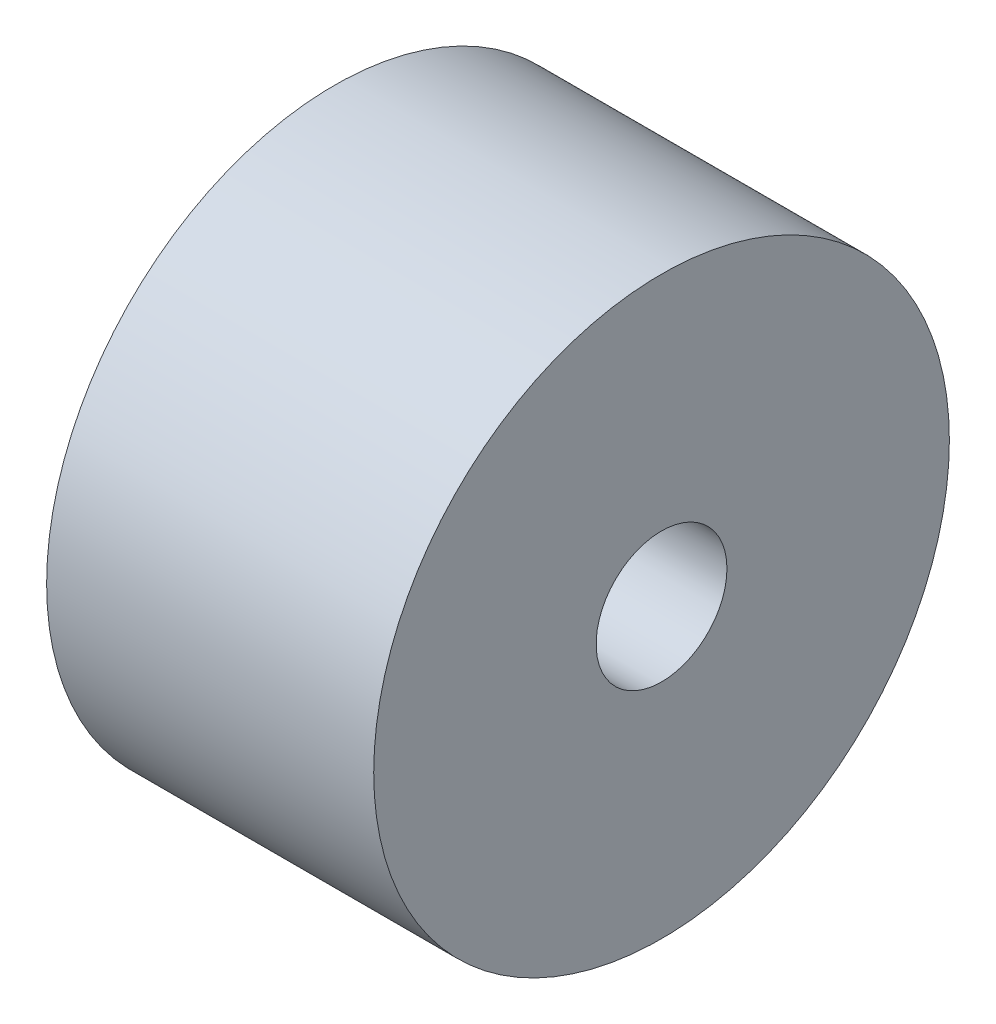
ISO-10303-21;
HEADER;
FILE_DESCRIPTION(('STEP AP214'),'2;1');
FILE_NAME('part.step','',(''),(''),'','','');
FILE_SCHEMA(('AUTOMOTIVE_DESIGN { 1 0 10303 214 1 1 1 1 }'));
ENDSEC;
DATA;
#1=APPLICATION_CONTEXT('core data for automotive mechanical design processes');
#2=APPLICATION_PROTOCOL_DEFINITION('international standard','automotive_design',2000,#1);
#3=PRODUCT_CONTEXT('',#1,'mechanical');
#4=PRODUCT('Part','Part','',(#3));
#5=PRODUCT_RELATED_PRODUCT_CATEGORY('part','',(#4));
#6=PRODUCT_DEFINITION_FORMATION('','',#4);
#7=PRODUCT_DEFINITION_CONTEXT('part definition',#1,'design');
#8=PRODUCT_DEFINITION('design','',#6,#7);
#9=PRODUCT_DEFINITION_SHAPE('','',#8);
#10=(LENGTH_UNIT() NAMED_UNIT(*) SI_UNIT(.MILLI.,.METRE.));
#11=(NAMED_UNIT(*) PLANE_ANGLE_UNIT() SI_UNIT($,.RADIAN.));
#12=(NAMED_UNIT(*) SI_UNIT($,.STERADIAN.) SOLID_ANGLE_UNIT());
#13=UNCERTAINTY_MEASURE_WITH_UNIT(LENGTH_MEASURE(1.E-05),#10,'distance_accuracy_value','');
#14=(GEOMETRIC_REPRESENTATION_CONTEXT(3) GLOBAL_UNCERTAINTY_ASSIGNED_CONTEXT((#13)) GLOBAL_UNIT_ASSIGNED_CONTEXT((#10,
#11,#12)) REPRESENTATION_CONTEXT('',''));
#15=CARTESIAN_POINT('',(0.,0.,0.));
#16=DIRECTION('',(0.,0.,1.));
#17=DIRECTION('',(1.,0.,0.));
#18=AXIS2_PLACEMENT_3D('',#15,#16,#17);
#19=CARTESIAN_POINT('',(5.,0.,0.));
#20=DIRECTION('',(1.,0.,0.));
#21=DIRECTION('',(0.,0.,-1.));
#22=AXIS2_PLACEMENT_3D('',#19,#20,#21);
#23=PLANE('',#22);
#24=CARTESIAN_POINT('',(5.,0.,0.));
#25=DIRECTION('',(1.,0.,0.));
#26=DIRECTION('',(0.,0.,-1.));
#27=AXIS2_PLACEMENT_3D('',#24,#25,#26);
#28=CIRCLE('',#27,4.4);
#29=CARTESIAN_POINT('',(5.,0.,-4.4));
#30=VERTEX_POINT('',#29);
#31=EDGE_CURVE('E10',#30,#30,#28,.T.);
#32=ORIENTED_EDGE('',*,*,#31,.T.);
#33=EDGE_LOOP('',(#32));
#34=FACE_BOUND('',#33,.T.);
#35=CARTESIAN_POINT('',(5.,0.,0.));
#36=DIRECTION('',(1.,0.,0.));
#37=DIRECTION('',(0.,0.,-1.));
#38=AXIS2_PLACEMENT_3D('',#35,#36,#37);
#39=CIRCLE('',#38,1.);
#40=CARTESIAN_POINT('',(5.,0.,-1.));
#41=VERTEX_POINT('',#40);
#42=EDGE_CURVE('E44',#41,#41,#39,.T.);
#43=ORIENTED_EDGE('',*,*,#42,.F.);
#44=EDGE_LOOP('',(#43));
#45=FACE_BOUND('',#44,.T.);
#46=ADVANCED_FACE('F33',(#34,#45),#23,.T.);
#47=CARTESIAN_POINT('',(0.,0.,0.));
#48=DIRECTION('',(1.,0.,0.));
#49=DIRECTION('',(0.,0.,-1.));
#50=AXIS2_PLACEMENT_3D('',#47,#48,#49);
#51=PLANE('',#50);
#52=CARTESIAN_POINT('',(0.,0.,0.));
#53=DIRECTION('',(1.,0.,0.));
#54=DIRECTION('',(0.,0.,-1.));
#55=AXIS2_PLACEMENT_3D('',#52,#53,#54);
#56=CIRCLE('',#55,4.4);
#57=CARTESIAN_POINT('',(0.,0.,-4.4));
#58=VERTEX_POINT('',#57);
#59=EDGE_CURVE('E37',#58,#58,#56,.T.);
#60=ORIENTED_EDGE('',*,*,#59,.F.);
#61=EDGE_LOOP('',(#60));
#62=FACE_BOUND('',#61,.T.);
#63=CARTESIAN_POINT('',(0.,0.,0.));
#64=DIRECTION('',(1.,0.,0.));
#65=DIRECTION('',(0.,0.,-1.));
#66=AXIS2_PLACEMENT_3D('',#63,#64,#65);
#67=CIRCLE('',#66,1.);
#68=CARTESIAN_POINT('',(0.,0.,-1.));
#69=VERTEX_POINT('',#68);
#70=EDGE_CURVE('E46',#69,#69,#67,.T.);
#71=ORIENTED_EDGE('',*,*,#70,.T.);
#72=EDGE_LOOP('',(#71));
#73=FACE_BOUND('',#72,.T.);
#74=ADVANCED_FACE('F56',(#62,#73),#51,.F.);
#75=CARTESIAN_POINT('',(5.,0.,0.));
#76=DIRECTION('',(-1.,0.,0.));
#77=DIRECTION('',(0.,0.,1.));
#78=AXIS2_PLACEMENT_3D('',#75,#76,#77);
#79=CYLINDRICAL_SURFACE('',#78,4.4);
#80=ORIENTED_EDGE('',*,*,#31,.F.);
#81=EDGE_LOOP('',(#80));
#82=FACE_BOUND('',#81,.T.);
#83=ORIENTED_EDGE('',*,*,#59,.T.);
#84=EDGE_LOOP('',(#83));
#85=FACE_BOUND('',#84,.T.);
#86=ADVANCED_FACE('F35',(#82,#85),#79,.T.);
#87=CARTESIAN_POINT('',(5.,0.,0.));
#88=DIRECTION('',(-1.,0.,0.));
#89=DIRECTION('',(0.,0.,1.));
#90=AXIS2_PLACEMENT_3D('',#87,#88,#89);
#91=CYLINDRICAL_SURFACE('',#90,1.);
#92=ORIENTED_EDGE('',*,*,#42,.T.);
#93=EDGE_LOOP('',(#92));
#94=FACE_BOUND('',#93,.T.);
#95=ORIENTED_EDGE('',*,*,#70,.F.);
#96=EDGE_LOOP('',(#95));
#97=FACE_BOUND('',#96,.T.);
#98=ADVANCED_FACE('F52',(#94,#97),#91,.F.);
#99=CLOSED_SHELL('',(#46,#74,#86,#98));
#100=MANIFOLD_SOLID_BREP('B2',#99);
#101=ADVANCED_BREP_SHAPE_REPRESENTATION('',(#18,#100),#14);
#102=SHAPE_DEFINITION_REPRESENTATION(#9,#101);
ENDSEC;
END-ISO-10303-21;
